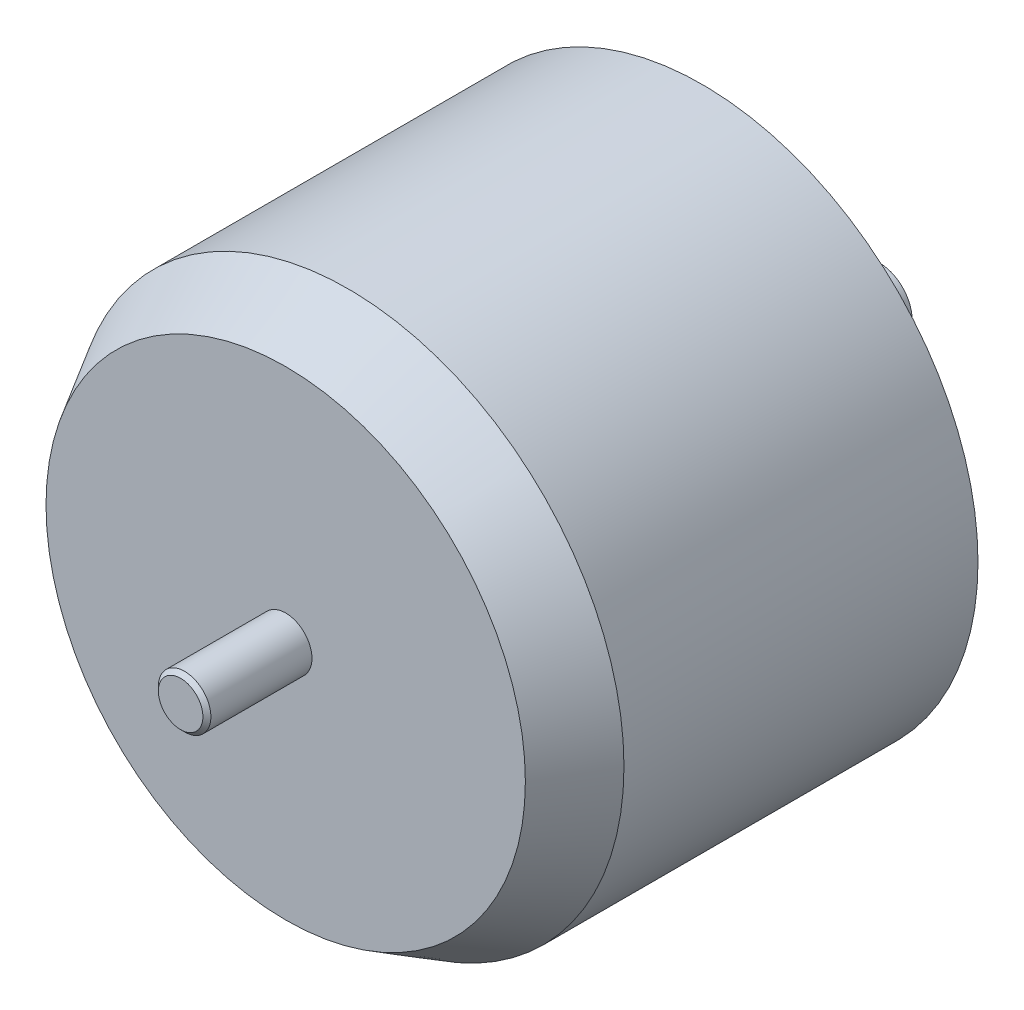
ISO-10303-21;
HEADER;
FILE_DESCRIPTION(('STEP AP214'),'2;1');
FILE_NAME('part.step','',(''),(''),'','','');
FILE_SCHEMA(('AUTOMOTIVE_DESIGN { 1 0 10303 214 1 1 1 1 }'));
ENDSEC;
DATA;
#1=APPLICATION_CONTEXT('core data for automotive mechanical design processes');
#2=APPLICATION_PROTOCOL_DEFINITION('international standard','automotive_design',2000,#1);
#3=PRODUCT_CONTEXT('',#1,'mechanical');
#4=PRODUCT('Part','Part','',(#3));
#5=PRODUCT_RELATED_PRODUCT_CATEGORY('part','',(#4));
#6=PRODUCT_DEFINITION_FORMATION('','',#4);
#7=PRODUCT_DEFINITION_CONTEXT('part definition',#1,'design');
#8=PRODUCT_DEFINITION('design','',#6,#7);
#9=PRODUCT_DEFINITION_SHAPE('','',#8);
#10=(LENGTH_UNIT() NAMED_UNIT(*) SI_UNIT(.MILLI.,.METRE.));
#11=(NAMED_UNIT(*) PLANE_ANGLE_UNIT() SI_UNIT($,.RADIAN.));
#12=(NAMED_UNIT(*) SI_UNIT($,.STERADIAN.) SOLID_ANGLE_UNIT());
#13=UNCERTAINTY_MEASURE_WITH_UNIT(LENGTH_MEASURE(1.E-05),#10,'distance_accuracy_value','');
#14=(GEOMETRIC_REPRESENTATION_CONTEXT(3) GLOBAL_UNCERTAINTY_ASSIGNED_CONTEXT((#13)) GLOBAL_UNIT_ASSIGNED_CONTEXT((#10,
#11,#12)) REPRESENTATION_CONTEXT('',''));
#15=CARTESIAN_POINT('',(0.,0.,0.));
#16=DIRECTION('',(0.,0.,1.));
#17=DIRECTION('',(1.,0.,0.));
#18=AXIS2_PLACEMENT_3D('',#15,#16,#17);
#19=CARTESIAN_POINT('',(0.,0.,-1.9));
#20=DIRECTION('',(0.,0.,1.));
#21=DIRECTION('',(1.,0.,0.));
#22=AXIS2_PLACEMENT_3D('',#19,#20,#21);
#23=CYLINDRICAL_SURFACE('',#22,1.25);
#24=CARTESIAN_POINT('',(0.,0.,-0.95));
#25=DIRECTION('',(0.,0.,1.));
#26=DIRECTION('',(1.,0.,0.));
#27=AXIS2_PLACEMENT_3D('',#24,#25,#26);
#28=CIRCLE('',#27,1.25);
#29=CARTESIAN_POINT('',(1.25,0.,-0.95));
#30=VERTEX_POINT('',#29);
#31=EDGE_CURVE('E68',#30,#30,#28,.T.);
#32=ORIENTED_EDGE('',*,*,#31,.F.);
#33=EDGE_LOOP('',(#32));
#34=FACE_BOUND('',#33,.T.);
#35=CARTESIAN_POINT('',(0.,0.,-3.9));
#36=DIRECTION('',(0.,0.,-1.));
#37=DIRECTION('',(-1.,0.,0.));
#38=AXIS2_PLACEMENT_3D('',#35,#36,#37);
#39=CIRCLE('',#38,1.25);
#40=CARTESIAN_POINT('',(-1.25,0.,-3.9));
#41=VERTEX_POINT('',#40);
#42=EDGE_CURVE('E71',#41,#41,#39,.T.);
#43=ORIENTED_EDGE('',*,*,#42,.F.);
#44=EDGE_LOOP('',(#43));
#45=FACE_BOUND('',#44,.T.);
#46=ADVANCED_FACE('F34',(#34,#45),#23,.T.);
#47=CARTESIAN_POINT('',(0.,0.,22.7));
#48=DIRECTION('',(0.,0.,1.));
#49=DIRECTION('',(1.,0.,0.));
#50=AXIS2_PLACEMENT_3D('',#47,#48,#49);
#51=PLANE('',#50);
#52=CARTESIAN_POINT('',(0.,0.,22.7));
#53=DIRECTION('',(0.,0.,1.));
#54=DIRECTION('',(1.,0.,0.));
#55=AXIS2_PLACEMENT_3D('',#52,#53,#54);
#56=CIRCLE('',#55,0.84759999998596);
#57=CARTESIAN_POINT('',(0.84759999998596,0.,22.7));
#58=VERTEX_POINT('',#57);
#59=EDGE_CURVE('E10',#58,#58,#56,.T.);
#60=ORIENTED_EDGE('',*,*,#59,.T.);
#61=EDGE_LOOP('',(#60));
#62=FACE_BOUND('',#61,.T.);
#63=ADVANCED_FACE('F78',(#62),#51,.T.);
#64=CARTESIAN_POINT('',(0.,0.,22.7));
#65=DIRECTION('',(0.,0.,-1.));
#66=DIRECTION('',(-1.,0.,0.));
#67=AXIS2_PLACEMENT_3D('',#64,#65,#66);
#68=CONICAL_SURFACE('',#67,0.84759999998596,0.78539816339745);
#69=CARTESIAN_POINT('',(0.,0.,22.5476000000353));
#70=DIRECTION('',(0.,0.,1.));
#71=DIRECTION('',(1.,0.,0.));
#72=AXIS2_PLACEMENT_3D('',#69,#70,#71);
#73=CIRCLE('',#72,0.999999999950628);
#74=CARTESIAN_POINT('',(0.999999999950628,0.,22.5476000000353));
#75=VERTEX_POINT('',#74);
#76=EDGE_CURVE('E40',#75,#75,#73,.T.);
#77=ORIENTED_EDGE('',*,*,#76,.T.);
#78=EDGE_LOOP('',(#77));
#79=FACE_BOUND('',#78,.T.);
#80=ORIENTED_EDGE('',*,*,#59,.F.);
#81=EDGE_LOOP('',(#80));
#82=FACE_BOUND('',#81,.T.);
#83=ADVANCED_FACE('F83',(#79,#82),#68,.T.);
#84=CARTESIAN_POINT('',(0.,0.,-1.9));
#85=DIRECTION('',(0.,0.,1.));
#86=DIRECTION('',(1.,0.,0.));
#87=AXIS2_PLACEMENT_3D('',#84,#85,#86);
#88=CYLINDRICAL_SURFACE('',#87,0.999999999950628);
#89=CARTESIAN_POINT('',(0.,0.,18.7000000000353));
#90=DIRECTION('',(0.,0.,1.));
#91=DIRECTION('',(1.,0.,0.));
#92=AXIS2_PLACEMENT_3D('',#89,#90,#91);
#93=CIRCLE('',#92,0.999999999950628);
#94=CARTESIAN_POINT('',(0.999999999950628,0.,18.7000000000353));
#95=VERTEX_POINT('',#94);
#96=EDGE_CURVE('E44',#95,#95,#93,.T.);
#97=ORIENTED_EDGE('',*,*,#96,.T.);
#98=EDGE_LOOP('',(#97));
#99=FACE_BOUND('',#98,.T.);
#100=ORIENTED_EDGE('',*,*,#76,.F.);
#101=EDGE_LOOP('',(#100));
#102=FACE_BOUND('',#101,.T.);
#103=ADVANCED_FACE('F125',(#99,#102),#88,.T.);
#104=CARTESIAN_POINT('',(0.999999999950628,0.,18.7000000000353));
#105=DIRECTION('',(0.,0.,1.));
#106=DIRECTION('',(1.,0.,0.));
#107=AXIS2_PLACEMENT_3D('',#104,#105,#106);
#108=PLANE('',#107);
#109=CARTESIAN_POINT('',(0.,0.,18.7000000000353));
#110=DIRECTION('',(0.,0.,1.));
#111=DIRECTION('',(1.,0.,0.));
#112=AXIS2_PLACEMENT_3D('',#109,#110,#111);
#113=CIRCLE('',#112,9.12590635927933);
#114=CARTESIAN_POINT('',(9.12590635927933,0.,18.7000000000353));
#115=VERTEX_POINT('',#114);
#116=EDGE_CURVE('E48',#115,#115,#113,.T.);
#117=ORIENTED_EDGE('',*,*,#116,.T.);
#118=EDGE_LOOP('',(#117));
#119=FACE_BOUND('',#118,.T.);
#120=ORIENTED_EDGE('',*,*,#96,.F.);
#121=EDGE_LOOP('',(#120));
#122=FACE_BOUND('',#121,.T.);
#123=ADVANCED_FACE('F119',(#119,#122),#108,.T.);
#124=CARTESIAN_POINT('',(0.,0.,18.7000000000353));
#125=DIRECTION('',(0.,0.,-1.));
#126=DIRECTION('',(-1.,0.,0.));
#127=AXIS2_PLACEMENT_3D('',#124,#125,#126);
#128=CONICAL_SURFACE('',#127,9.12590635927933,0.523598775598299);
#129=CARTESIAN_POINT('',(0.,0.,16.3200000000353));
#130=DIRECTION('',(0.,0.,1.));
#131=DIRECTION('',(1.,0.,0.));
#132=AXIS2_PLACEMENT_3D('',#129,#130,#131);
#133=CIRCLE('',#132,10.4999999999506);
#134=CARTESIAN_POINT('',(10.4999999999506,0.,16.3200000000353));
#135=VERTEX_POINT('',#134);
#136=EDGE_CURVE('E53',#135,#135,#133,.T.);
#137=ORIENTED_EDGE('',*,*,#136,.T.);
#138=EDGE_LOOP('',(#137));
#139=FACE_BOUND('',#138,.T.);
#140=ORIENTED_EDGE('',*,*,#116,.F.);
#141=EDGE_LOOP('',(#140));
#142=FACE_BOUND('',#141,.T.);
#143=ADVANCED_FACE('F113',(#139,#142),#128,.T.);
#144=CARTESIAN_POINT('',(0.,0.,-1.9));
#145=DIRECTION('',(0.,0.,1.));
#146=DIRECTION('',(1.,0.,0.));
#147=AXIS2_PLACEMENT_3D('',#144,#145,#146);
#148=CYLINDRICAL_SURFACE('',#147,10.4999999999506);
#149=CARTESIAN_POINT('',(0.,0.,2.84056332444829));
#150=DIRECTION('',(0.,0.,1.));
#151=DIRECTION('',(1.,0.,0.));
#152=AXIS2_PLACEMENT_3D('',#149,#150,#151);
#153=CIRCLE('',#152,10.4999999999506);
#154=CARTESIAN_POINT('',(10.4999999999506,0.,2.84056332444829));
#155=VERTEX_POINT('',#154);
#156=EDGE_CURVE('E56',#155,#155,#153,.T.);
#157=ORIENTED_EDGE('',*,*,#156,.T.);
#158=EDGE_LOOP('',(#157));
#159=FACE_BOUND('',#158,.T.);
#160=ORIENTED_EDGE('',*,*,#136,.F.);
#161=EDGE_LOOP('',(#160));
#162=FACE_BOUND('',#161,.T.);
#163=ADVANCED_FACE('F107',(#159,#162),#148,.T.);
#164=CARTESIAN_POINT('',(0.,0.,2.84056332444829));
#165=DIRECTION('',(0.,0.,1.));
#166=DIRECTION('',(1.,0.,0.));
#167=AXIS2_PLACEMENT_3D('',#164,#165,#166);
#168=CONICAL_SURFACE('',#167,10.4999999999506,1.0471975511966);
#169=CARTESIAN_POINT('',(0.,0.,3.53170184069773E-11));
#170=DIRECTION('',(0.,0.,1.));
#171=DIRECTION('',(1.,0.,0.));
#172=AXIS2_PLACEMENT_3D('',#169,#170,#171);
#173=CIRCLE('',#172,5.57999999995062);
#174=CARTESIAN_POINT('',(5.57999999995062,0.,3.53170184069773E-11));
#175=VERTEX_POINT('',#174);
#176=EDGE_CURVE('E59',#175,#175,#173,.T.);
#177=ORIENTED_EDGE('',*,*,#176,.T.);
#178=EDGE_LOOP('',(#177));
#179=FACE_BOUND('',#178,.T.);
#180=ORIENTED_EDGE('',*,*,#156,.F.);
#181=EDGE_LOOP('',(#180));
#182=FACE_BOUND('',#181,.T.);
#183=ADVANCED_FACE('F101',(#179,#182),#168,.T.);
#184=CARTESIAN_POINT('',(5.57999999995062,0.,3.53172394084806E-11));
#185=DIRECTION('',(0.,0.,-1.));
#186=DIRECTION('',(-1.,0.,0.));
#187=AXIS2_PLACEMENT_3D('',#184,#185,#186);
#188=PLANE('',#187);
#189=CARTESIAN_POINT('',(0.,0.,3.53174520878463E-11));
#190=DIRECTION('',(0.,0.,1.));
#191=DIRECTION('',(1.,0.,0.));
#192=AXIS2_PLACEMENT_3D('',#189,#190,#191);
#193=CIRCLE('',#192,2.74999999995064);
#194=CARTESIAN_POINT('',(2.74999999995064,0.,3.53174520878463E-11));
#195=VERTEX_POINT('',#194);
#196=EDGE_CURVE('E62',#195,#195,#193,.T.);
#197=ORIENTED_EDGE('',*,*,#196,.T.);
#198=EDGE_LOOP('',(#197));
#199=FACE_BOUND('',#198,.T.);
#200=ORIENTED_EDGE('',*,*,#176,.F.);
#201=EDGE_LOOP('',(#200));
#202=FACE_BOUND('',#201,.T.);
#203=ADVANCED_FACE('F95',(#199,#202),#188,.T.);
#204=CARTESIAN_POINT('',(0.,0.,-1.9));
#205=DIRECTION('',(0.,0.,1.));
#206=DIRECTION('',(1.,0.,0.));
#207=AXIS2_PLACEMENT_3D('',#204,#205,#206);
#208=CYLINDRICAL_SURFACE('',#207,2.74999999995064);
#209=CARTESIAN_POINT('',(0.,0.,-0.95));
#210=DIRECTION('',(0.,0.,1.));
#211=DIRECTION('',(1.,0.,0.));
#212=AXIS2_PLACEMENT_3D('',#209,#210,#211);
#213=CIRCLE('',#212,2.74999999995064);
#214=CARTESIAN_POINT('',(2.74999999995064,0.,-0.95));
#215=VERTEX_POINT('',#214);
#216=EDGE_CURVE('E65',#215,#215,#213,.T.);
#217=ORIENTED_EDGE('',*,*,#216,.T.);
#218=EDGE_LOOP('',(#217));
#219=FACE_BOUND('',#218,.T.);
#220=ORIENTED_EDGE('',*,*,#196,.F.);
#221=EDGE_LOOP('',(#220));
#222=FACE_BOUND('',#221,.T.);
#223=ADVANCED_FACE('F89',(#219,#222),#208,.T.);
#224=CARTESIAN_POINT('',(2.74999999995064,0.,-0.95));
#225=DIRECTION('',(0.,0.,-1.));
#226=DIRECTION('',(-1.,0.,0.));
#227=AXIS2_PLACEMENT_3D('',#224,#225,#226);
#228=PLANE('',#227);
#229=ORIENTED_EDGE('',*,*,#31,.T.);
#230=EDGE_LOOP('',(#229));
#231=FACE_BOUND('',#230,.T.);
#232=ORIENTED_EDGE('',*,*,#216,.F.);
#233=EDGE_LOOP('',(#232));
#234=FACE_BOUND('',#233,.T.);
#235=ADVANCED_FACE('F86',(#231,#234),#228,.T.);
#236=CARTESIAN_POINT('',(0.,0.,-3.9));
#237=DIRECTION('',(0.,0.,-1.));
#238=DIRECTION('',(-1.,0.,0.));
#239=AXIS2_PLACEMENT_3D('',#236,#237,#238);
#240=PLANE('',#239);
#241=ORIENTED_EDGE('',*,*,#42,.T.);
#242=EDGE_LOOP('',(#241));
#243=FACE_BOUND('',#242,.T.);
#244=ADVANCED_FACE('F75',(#243),#240,.T.);
#245=CLOSED_SHELL('',(#46,#63,#83,#103,#123,#143,#163,#183,#203,#223,#235,#244));
#246=MANIFOLD_SOLID_BREP('B2',#245);
#247=ADVANCED_BREP_SHAPE_REPRESENTATION('',(#18,#246),#14);
#248=SHAPE_DEFINITION_REPRESENTATION(#9,#247);
ENDSEC;
END-ISO-10303-21;
